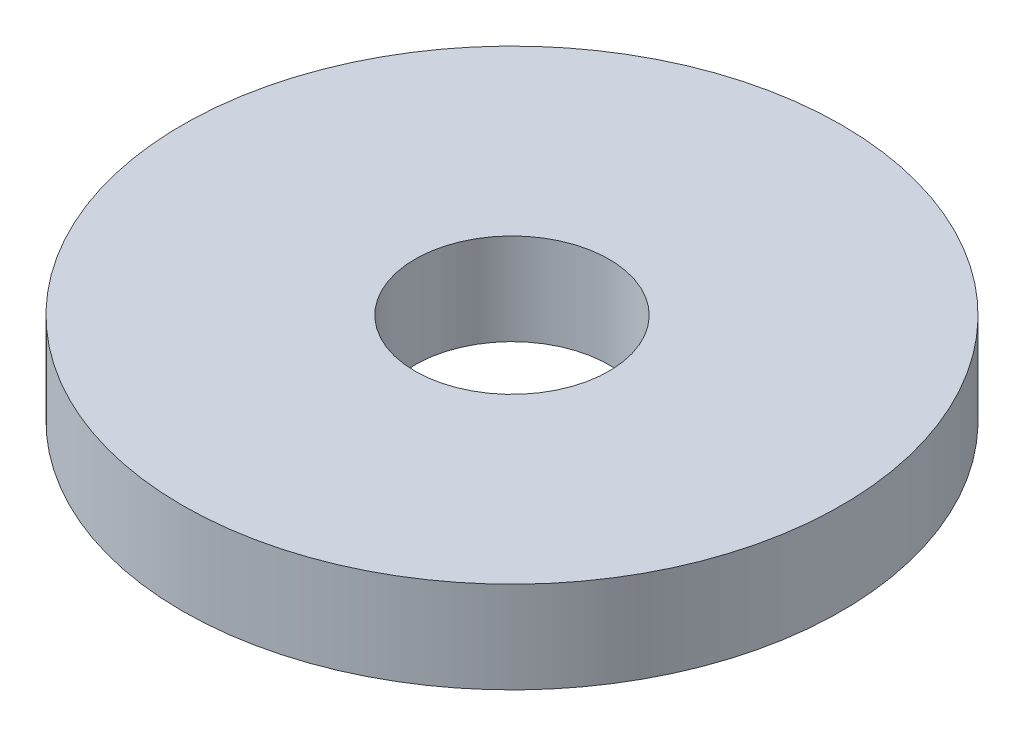
ISO-10303-21;
HEADER;
FILE_DESCRIPTION(('STEP AP214'),'2;1');
FILE_NAME('part.step','',(''),(''),'','','');
FILE_SCHEMA(('AUTOMOTIVE_DESIGN { 1 0 10303 214 1 1 1 1 }'));
ENDSEC;
DATA;
#1=APPLICATION_CONTEXT('core data for automotive mechanical design processes');
#2=APPLICATION_PROTOCOL_DEFINITION('international standard','automotive_design',2000,#1);
#3=PRODUCT_CONTEXT('',#1,'mechanical');
#4=PRODUCT('Part','Part','',(#3));
#5=PRODUCT_RELATED_PRODUCT_CATEGORY('part','',(#4));
#6=PRODUCT_DEFINITION_FORMATION('','',#4);
#7=PRODUCT_DEFINITION_CONTEXT('part definition',#1,'design');
#8=PRODUCT_DEFINITION('design','',#6,#7);
#9=PRODUCT_DEFINITION_SHAPE('','',#8);
#10=(LENGTH_UNIT() NAMED_UNIT(*) SI_UNIT(.MILLI.,.METRE.));
#11=(NAMED_UNIT(*) PLANE_ANGLE_UNIT() SI_UNIT($,.RADIAN.));
#12=(NAMED_UNIT(*) SI_UNIT($,.STERADIAN.) SOLID_ANGLE_UNIT());
#13=UNCERTAINTY_MEASURE_WITH_UNIT(LENGTH_MEASURE(1.E-05),#10,'distance_accuracy_value','');
#14=(GEOMETRIC_REPRESENTATION_CONTEXT(3) GLOBAL_UNCERTAINTY_ASSIGNED_CONTEXT((#13)) GLOBAL_UNIT_ASSIGNED_CONTEXT((#10,
#11,#12)) REPRESENTATION_CONTEXT('',''));
#15=CARTESIAN_POINT('',(0.,0.,0.));
#16=DIRECTION('',(0.,0.,1.));
#17=DIRECTION('',(1.,0.,0.));
#18=AXIS2_PLACEMENT_3D('',#15,#16,#17);
#19=CARTESIAN_POINT('',(0.,2.5,0.));
#20=DIRECTION('',(0.,-1.,0.));
#21=DIRECTION('',(0.,0.,-1.));
#22=AXIS2_PLACEMENT_3D('',#19,#20,#21);
#23=CYLINDRICAL_SURFACE('',#22,9.);
#24=CARTESIAN_POINT('',(0.,2.5,0.));
#25=DIRECTION('',(0.,1.,0.));
#26=DIRECTION('',(0.,0.,1.));
#27=AXIS2_PLACEMENT_3D('',#24,#25,#26);
#28=CIRCLE('',#27,9.);
#29=CARTESIAN_POINT('',(0.,2.5,9.));
#30=VERTEX_POINT('',#29);
#31=EDGE_CURVE('E10',#30,#30,#28,.T.);
#32=ORIENTED_EDGE('',*,*,#31,.F.);
#33=EDGE_LOOP('',(#32));
#34=FACE_BOUND('',#33,.T.);
#35=CARTESIAN_POINT('',(0.,0.,0.));
#36=DIRECTION('',(0.,1.,0.));
#37=DIRECTION('',(0.,0.,1.));
#38=AXIS2_PLACEMENT_3D('',#35,#36,#37);
#39=CIRCLE('',#38,9.);
#40=CARTESIAN_POINT('',(0.,0.,9.));
#41=VERTEX_POINT('',#40);
#42=EDGE_CURVE('E46',#41,#41,#39,.T.);
#43=ORIENTED_EDGE('',*,*,#42,.T.);
#44=EDGE_LOOP('',(#43));
#45=FACE_BOUND('',#44,.T.);
#46=ADVANCED_FACE('F43',(#34,#45),#23,.T.);
#47=CARTESIAN_POINT('',(0.,2.5,0.));
#48=DIRECTION('',(0.,1.,0.));
#49=DIRECTION('',(0.,0.,1.));
#50=AXIS2_PLACEMENT_3D('',#47,#48,#49);
#51=PLANE('',#50);
#52=CARTESIAN_POINT('',(0.,2.5,0.));
#53=DIRECTION('',(0.,1.,0.));
#54=DIRECTION('',(0.,0.,1.));
#55=AXIS2_PLACEMENT_3D('',#52,#53,#54);
#56=CIRCLE('',#55,2.65);
#57=CARTESIAN_POINT('',(0.,2.5,2.65));
#58=VERTEX_POINT('',#57);
#59=EDGE_CURVE('E57',#58,#58,#56,.T.);
#60=ORIENTED_EDGE('',*,*,#59,.F.);
#61=EDGE_LOOP('',(#60));
#62=FACE_BOUND('',#61,.T.);
#63=ORIENTED_EDGE('',*,*,#31,.T.);
#64=EDGE_LOOP('',(#63));
#65=FACE_BOUND('',#64,.T.);
#66=ADVANCED_FACE('F74',(#62,#65),#51,.T.);
#67=CARTESIAN_POINT('',(0.,0.,0.));
#68=DIRECTION('',(0.,1.,0.));
#69=DIRECTION('',(0.,0.,1.));
#70=AXIS2_PLACEMENT_3D('',#67,#68,#69);
#71=PLANE('',#70);
#72=CARTESIAN_POINT('',(0.,0.,0.));
#73=DIRECTION('',(0.,1.,0.));
#74=DIRECTION('',(0.,0.,1.));
#75=AXIS2_PLACEMENT_3D('',#72,#73,#74);
#76=CIRCLE('',#75,2.65);
#77=CARTESIAN_POINT('',(0.,0.,2.65));
#78=VERTEX_POINT('',#77);
#79=EDGE_CURVE('E55',#78,#78,#76,.T.);
#80=ORIENTED_EDGE('',*,*,#79,.T.);
#81=EDGE_LOOP('',(#80));
#82=FACE_BOUND('',#81,.T.);
#83=ORIENTED_EDGE('',*,*,#42,.F.);
#84=EDGE_LOOP('',(#83));
#85=FACE_BOUND('',#84,.T.);
#86=ADVANCED_FACE('F65',(#82,#85),#71,.F.);
#87=CARTESIAN_POINT('',(0.,0.,0.));
#88=DIRECTION('',(0.,1.,0.));
#89=DIRECTION('',(0.,0.,1.));
#90=AXIS2_PLACEMENT_3D('',#87,#88,#89);
#91=CYLINDRICAL_SURFACE('',#90,2.65);
#92=ORIENTED_EDGE('',*,*,#79,.F.);
#93=EDGE_LOOP('',(#92));
#94=FACE_BOUND('',#93,.T.);
#95=ORIENTED_EDGE('',*,*,#59,.T.);
#96=EDGE_LOOP('',(#95));
#97=FACE_BOUND('',#96,.T.);
#98=ADVANCED_FACE('F68',(#94,#97),#91,.F.);
#99=CLOSED_SHELL('',(#46,#66,#86,#98));
#100=MANIFOLD_SOLID_BREP('B2',#99);
#101=ADVANCED_BREP_SHAPE_REPRESENTATION('',(#18,#100),#14);
#102=SHAPE_DEFINITION_REPRESENTATION(#9,#101);
ENDSEC;
END-ISO-10303-21;
